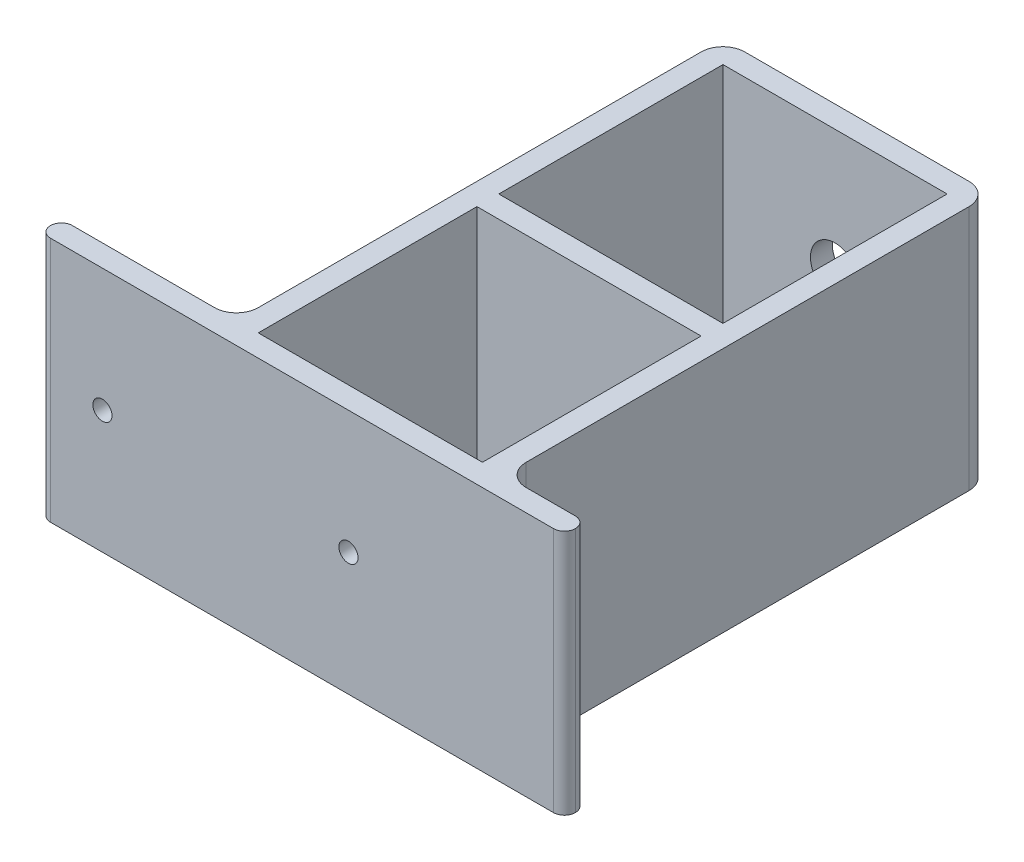
ISO-10303-21;
HEADER;
FILE_DESCRIPTION(('STEP AP214'),'2;1');
FILE_NAME('part.step','',(''),(''),'','','');
FILE_SCHEMA(('AUTOMOTIVE_DESIGN { 1 0 10303 214 1 1 1 1 }'));
ENDSEC;
DATA;
#1=APPLICATION_CONTEXT('core data for automotive mechanical design processes');
#2=APPLICATION_PROTOCOL_DEFINITION('international standard','automotive_design',2000,#1);
#3=PRODUCT_CONTEXT('',#1,'mechanical');
#4=PRODUCT('Part','Part','',(#3));
#5=PRODUCT_RELATED_PRODUCT_CATEGORY('part','',(#4));
#6=PRODUCT_DEFINITION_FORMATION('','',#4);
#7=PRODUCT_DEFINITION_CONTEXT('part definition',#1,'design');
#8=PRODUCT_DEFINITION('design','',#6,#7);
#9=PRODUCT_DEFINITION_SHAPE('','',#8);
#10=(LENGTH_UNIT() NAMED_UNIT(*) SI_UNIT(.MILLI.,.METRE.));
#11=(NAMED_UNIT(*) PLANE_ANGLE_UNIT() SI_UNIT($,.RADIAN.));
#12=(NAMED_UNIT(*) SI_UNIT($,.STERADIAN.) SOLID_ANGLE_UNIT());
#13=UNCERTAINTY_MEASURE_WITH_UNIT(LENGTH_MEASURE(1.E-05),#10,'distance_accuracy_value','');
#14=(GEOMETRIC_REPRESENTATION_CONTEXT(3) GLOBAL_UNCERTAINTY_ASSIGNED_CONTEXT((#13)) GLOBAL_UNIT_ASSIGNED_CONTEXT((#10,
#11,#12)) REPRESENTATION_CONTEXT('',''));
#15=CARTESIAN_POINT('',(0.,0.,0.));
#16=DIRECTION('',(0.,0.,1.));
#17=DIRECTION('',(1.,0.,0.));
#18=AXIS2_PLACEMENT_3D('',#15,#16,#17);
#19=CARTESIAN_POINT('',(-12.,-22.5,-85.));
#20=DIRECTION('',(-1.,0.,0.));
#21=DIRECTION('',(0.,-1.,0.));
#22=AXIS2_PLACEMENT_3D('',#19,#20,#21);
#23=PLANE('',#22);
#24=DIRECTION('',(0.,0.,1.));
#25=VECTOR('',#24,1.);
#26=CARTESIAN_POINT('',(-12.,-22.5,-85.));
#27=LINE('',#26,#25);
#28=CARTESIAN_POINT('',(-12.,-22.5,-40.));
#29=VERTEX_POINT('',#28);
#30=CARTESIAN_POINT('',(-12.,-22.5,0.));
#31=VERTEX_POINT('',#30);
#32=EDGE_CURVE('E242',#29,#31,#27,.T.);
#33=ORIENTED_EDGE('',*,*,#32,.F.);
#34=DIRECTION('',(0.,-1.,0.));
#35=VECTOR('',#34,1.);
#36=CARTESIAN_POINT('',(-12.,63.694659848092,-40.));
#37=LINE('',#36,#35);
#38=CARTESIAN_POINT('',(-12.,22.5,-40.));
#39=VERTEX_POINT('',#38);
#40=EDGE_CURVE('E413',#39,#29,#37,.T.);
#41=ORIENTED_EDGE('',*,*,#40,.F.);
#42=DIRECTION('',(0.,0.,1.));
#43=VECTOR('',#42,1.);
#44=CARTESIAN_POINT('',(-12.,22.5,-85.));
#45=LINE('',#44,#43);
#46=CARTESIAN_POINT('',(-12.,22.5,0.));
#47=VERTEX_POINT('',#46);
#48=EDGE_CURVE('E245',#39,#47,#45,.T.);
#49=ORIENTED_EDGE('',*,*,#48,.T.);
#50=DIRECTION('',(0.,-1.,0.));
#51=VECTOR('',#50,1.);
#52=CARTESIAN_POINT('',(-12.,-22.5,0.));
#53=LINE('',#52,#51);
#54=EDGE_CURVE('E219',#47,#31,#53,.T.);
#55=ORIENTED_EDGE('',*,*,#54,.T.);
#56=EDGE_LOOP('',(#33,#41,#49,#55));
#57=FACE_BOUND('',#56,.T.);
#58=ADVANCED_FACE('F39',(#57),#23,.F.);
#59=CARTESIAN_POINT('',(29.,-22.5,-85.));
#60=DIRECTION('',(1.,0.,0.));
#61=DIRECTION('',(0.,0.,-1.));
#62=AXIS2_PLACEMENT_3D('',#59,#60,#61);
#63=PLANE('',#62);
#64=DIRECTION('',(0.,0.,1.));
#65=VECTOR('',#64,1.);
#66=CARTESIAN_POINT('',(29.,22.5,-85.));
#67=LINE('',#66,#65);
#68=CARTESIAN_POINT('',(29.,22.5,-40.));
#69=VERTEX_POINT('',#68);
#70=CARTESIAN_POINT('',(29.,22.5,0.));
#71=VERTEX_POINT('',#70);
#72=EDGE_CURVE('E421',#69,#71,#67,.T.);
#73=ORIENTED_EDGE('',*,*,#72,.F.);
#74=DIRECTION('',(0.,-1.,0.));
#75=VECTOR('',#74,1.);
#76=CARTESIAN_POINT('',(29.,63.694659848092,-40.));
#77=LINE('',#76,#75);
#78=CARTESIAN_POINT('',(29.,-22.5,-40.));
#79=VERTEX_POINT('',#78);
#80=EDGE_CURVE('E199',#69,#79,#77,.T.);
#81=ORIENTED_EDGE('',*,*,#80,.T.);
#82=DIRECTION('',(0.,0.,1.));
#83=VECTOR('',#82,1.);
#84=CARTESIAN_POINT('',(29.,-22.5,-85.));
#85=LINE('',#84,#83);
#86=CARTESIAN_POINT('',(29.,-22.5,0.));
#87=VERTEX_POINT('',#86);
#88=EDGE_CURVE('E220',#79,#87,#85,.T.);
#89=ORIENTED_EDGE('',*,*,#88,.T.);
#90=DIRECTION('',(0.,1.,0.));
#91=VECTOR('',#90,1.);
#92=CARTESIAN_POINT('',(29.,-22.5,0.));
#93=LINE('',#92,#91);
#94=EDGE_CURVE('E408',#87,#71,#93,.T.);
#95=ORIENTED_EDGE('',*,*,#94,.T.);
#96=EDGE_LOOP('',(#73,#81,#89,#95));
#97=FACE_BOUND('',#96,.T.);
#98=ADVANCED_FACE('F528',(#97),#63,.F.);
#99=CARTESIAN_POINT('',(0.,0.,0.));
#100=DIRECTION('',(0.,0.,-1.));
#101=DIRECTION('',(-1.,0.,0.));
#102=AXIS2_PLACEMENT_3D('',#99,#100,#101);
#103=PLANE('',#102);
#104=CARTESIAN_POINT('',(8.49999999999997,0.,0.));
#105=DIRECTION('',(0.,0.,1.));
#106=DIRECTION('',(1.,0.,0.));
#107=AXIS2_PLACEMENT_3D('',#104,#105,#106);
#108=CIRCLE('',#107,1.75);
#109=CARTESIAN_POINT('',(10.25,0.,0.));
#110=VERTEX_POINT('',#109);
#111=EDGE_CURVE('E254',#110,#110,#108,.T.);
#112=ORIENTED_EDGE('',*,*,#111,.T.);
#113=EDGE_LOOP('',(#112));
#114=FACE_BOUND('',#113,.T.);
#115=DIRECTION('',(-1.,0.,0.));
#116=VECTOR('',#115,1.);
#117=CARTESIAN_POINT('',(-48.,22.5,0.));
#118=LINE('',#117,#116);
#119=EDGE_CURVE('E280',#71,#47,#118,.T.);
#120=ORIENTED_EDGE('',*,*,#119,.F.);
#121=ORIENTED_EDGE('',*,*,#94,.F.);
#122=DIRECTION('',(1.,0.,0.));
#123=VECTOR('',#122,1.);
#124=CARTESIAN_POINT('',(-48.,-22.5,0.));
#125=LINE('',#124,#123);
#126=EDGE_CURVE('E283',#31,#87,#125,.T.);
#127=ORIENTED_EDGE('',*,*,#126,.F.);
#128=ORIENTED_EDGE('',*,*,#54,.F.);
#129=EDGE_LOOP('',(#120,#121,#127,#128));
#130=FACE_BOUND('',#129,.T.);
#131=ADVANCED_FACE('F406',(#114,#130),#103,.T.);
#132=CARTESIAN_POINT('',(46.,22.5,0.));
#133=VERTEX_POINT('',#132);
#134=CARTESIAN_POINT('',(37.,22.5,0.));
#135=VERTEX_POINT('',#134);
#136=EDGE_CURVE('E276',#133,#135,#118,.T.);
#137=ORIENTED_EDGE('',*,*,#136,.F.);
#138=DIRECTION('',(0.,1.,0.));
#139=VECTOR('',#138,1.);
#140=CARTESIAN_POINT('',(46.,-22.5,0.));
#141=LINE('',#140,#139);
#142=CARTESIAN_POINT('',(46.,-22.5,0.));
#143=VERTEX_POINT('',#142);
#144=EDGE_CURVE('E11',#133,#143,#141,.F.);
#145=ORIENTED_EDGE('',*,*,#144,.T.);
#146=CARTESIAN_POINT('',(37.,-22.5,0.));
#147=VERTEX_POINT('',#146);
#148=EDGE_CURVE('E279',#147,#143,#125,.T.);
#149=ORIENTED_EDGE('',*,*,#148,.F.);
#150=DIRECTION('',(0.,-1.,0.));
#151=VECTOR('',#150,1.);
#152=CARTESIAN_POINT('',(37.,0.,0.));
#153=LINE('',#152,#151);
#154=EDGE_CURVE('E321',#147,#135,#153,.F.);
#155=ORIENTED_EDGE('',*,*,#154,.T.);
#156=EDGE_LOOP('',(#137,#145,#149,#155));
#157=FACE_BOUND('',#156,.T.);
#158=ADVANCED_FACE('F391',(#157),#103,.T.);
#159=CARTESIAN_POINT('',(-46.,-22.5,0.));
#160=VERTEX_POINT('',#159);
#161=CARTESIAN_POINT('',(-20.,-22.5,0.));
#162=VERTEX_POINT('',#161);
#163=EDGE_CURVE('E271',#160,#162,#125,.T.);
#164=ORIENTED_EDGE('',*,*,#163,.F.);
#165=DIRECTION('',(0.,-1.,0.));
#166=VECTOR('',#165,1.);
#167=CARTESIAN_POINT('',(-46.,22.5,0.));
#168=LINE('',#167,#166);
#169=CARTESIAN_POINT('',(-46.,22.5,0.));
#170=VERTEX_POINT('',#169);
#171=EDGE_CURVE('E49',#160,#170,#168,.F.);
#172=ORIENTED_EDGE('',*,*,#171,.T.);
#173=CARTESIAN_POINT('',(-20.,22.5,0.));
#174=VERTEX_POINT('',#173);
#175=EDGE_CURVE('E262',#174,#170,#118,.T.);
#176=ORIENTED_EDGE('',*,*,#175,.F.);
#177=DIRECTION('',(0.,1.,0.));
#178=VECTOR('',#177,1.);
#179=CARTESIAN_POINT('',(-20.,0.,0.));
#180=LINE('',#179,#178);
#181=EDGE_CURVE('E290',#174,#162,#180,.F.);
#182=ORIENTED_EDGE('',*,*,#181,.T.);
#183=EDGE_LOOP('',(#164,#172,#176,#182));
#184=FACE_BOUND('',#183,.T.);
#185=CARTESIAN_POINT('',(-36.5,0.,0.));
#186=DIRECTION('',(0.,0.,1.));
#187=DIRECTION('',(1.,0.,0.));
#188=AXIS2_PLACEMENT_3D('',#185,#186,#187);
#189=CIRCLE('',#188,1.75);
#190=CARTESIAN_POINT('',(-34.75,0.,0.));
#191=VERTEX_POINT('',#190);
#192=EDGE_CURVE('E249',#191,#191,#189,.T.);
#193=ORIENTED_EDGE('',*,*,#192,.T.);
#194=EDGE_LOOP('',(#193));
#195=FACE_BOUND('',#194,.T.);
#196=ADVANCED_FACE('F439',(#184,#195),#103,.T.);
#197=CARTESIAN_POINT('',(0.,0.,4.));
#198=DIRECTION('',(0.,0.,-1.));
#199=DIRECTION('',(-1.,0.,0.));
#200=AXIS2_PLACEMENT_3D('',#197,#198,#199);
#201=PLANE('',#200);
#202=DIRECTION('',(-1.,0.,0.));
#203=VECTOR('',#202,1.);
#204=CARTESIAN_POINT('',(-48.,22.5,4.));
#205=LINE('',#204,#203);
#206=CARTESIAN_POINT('',(46.,22.5,4.));
#207=VERTEX_POINT('',#206);
#208=CARTESIAN_POINT('',(-46.,22.5,4.));
#209=VERTEX_POINT('',#208);
#210=EDGE_CURVE('E266',#207,#209,#205,.T.);
#211=ORIENTED_EDGE('',*,*,#210,.T.);
#212=DIRECTION('',(0.,-1.,0.));
#213=VECTOR('',#212,1.);
#214=CARTESIAN_POINT('',(-46.,0.,4.));
#215=LINE('',#214,#213);
#216=CARTESIAN_POINT('',(-46.,-22.5,4.));
#217=VERTEX_POINT('',#216);
#218=EDGE_CURVE('E341',#209,#217,#215,.T.);
#219=ORIENTED_EDGE('',*,*,#218,.T.);
#220=DIRECTION('',(1.,0.,0.));
#221=VECTOR('',#220,1.);
#222=CARTESIAN_POINT('',(-48.,-22.5,4.));
#223=LINE('',#222,#221);
#224=CARTESIAN_POINT('',(46.,-22.5,4.));
#225=VERTEX_POINT('',#224);
#226=EDGE_CURVE('E270',#217,#225,#223,.T.);
#227=ORIENTED_EDGE('',*,*,#226,.T.);
#228=DIRECTION('',(0.,1.,0.));
#229=VECTOR('',#228,1.);
#230=CARTESIAN_POINT('',(46.,0.,4.));
#231=LINE('',#230,#229);
#232=EDGE_CURVE('E337',#225,#207,#231,.T.);
#233=ORIENTED_EDGE('',*,*,#232,.T.);
#234=EDGE_LOOP('',(#211,#219,#227,#233));
#235=FACE_BOUND('',#234,.T.);
#236=CARTESIAN_POINT('',(8.49999999999997,0.,4.));
#237=DIRECTION('',(0.,0.,1.));
#238=DIRECTION('',(1.,0.,0.));
#239=AXIS2_PLACEMENT_3D('',#236,#237,#238);
#240=CIRCLE('',#239,1.75);
#241=CARTESIAN_POINT('',(10.25,0.,4.));
#242=VERTEX_POINT('',#241);
#243=EDGE_CURVE('E258',#242,#242,#240,.T.);
#244=ORIENTED_EDGE('',*,*,#243,.F.);
#245=EDGE_LOOP('',(#244));
#246=FACE_BOUND('',#245,.T.);
#247=CARTESIAN_POINT('',(-36.5,0.,4.));
#248=DIRECTION('',(0.,0.,1.));
#249=DIRECTION('',(1.,0.,0.));
#250=AXIS2_PLACEMENT_3D('',#247,#248,#249);
#251=CIRCLE('',#250,1.75);
#252=CARTESIAN_POINT('',(-34.75,0.,4.));
#253=VERTEX_POINT('',#252);
#254=EDGE_CURVE('E250',#253,#253,#251,.T.);
#255=ORIENTED_EDGE('',*,*,#254,.F.);
#256=EDGE_LOOP('',(#255));
#257=FACE_BOUND('',#256,.T.);
#258=ADVANCED_FACE('F436',(#235,#246,#257),#201,.F.);
#259=CARTESIAN_POINT('',(-48.,22.5,4.));
#260=DIRECTION('',(0.,-1.,0.));
#261=DIRECTION('',(0.,0.,-1.));
#262=AXIS2_PLACEMENT_3D('',#259,#260,#261);
#263=PLANE('',#262);
#264=ORIENTED_EDGE('',*,*,#48,.F.);
#265=DIRECTION('',(1.,0.,0.));
#266=VECTOR('',#265,1.);
#267=CARTESIAN_POINT('',(-12.,22.5,-40.));
#268=LINE('',#267,#266);
#269=EDGE_CURVE('E505',#39,#69,#268,.T.);
#270=ORIENTED_EDGE('',*,*,#269,.T.);
#271=ORIENTED_EDGE('',*,*,#72,.T.);
#272=ORIENTED_EDGE('',*,*,#119,.T.);
#273=EDGE_LOOP('',(#264,#270,#271,#272));
#274=FACE_BOUND('',#273,.T.);
#275=CARTESIAN_POINT('',(-12.,22.5,-85.));
#276=VERTEX_POINT('',#275);
#277=CARTESIAN_POINT('',(-12.,22.5,-44.));
#278=VERTEX_POINT('',#277);
#279=EDGE_CURVE('E246',#276,#278,#45,.T.);
#280=ORIENTED_EDGE('',*,*,#279,.F.);
#281=DIRECTION('',(1.,0.,0.));
#282=VECTOR('',#281,1.);
#283=CARTESIAN_POINT('',(33.,22.5,-85.));
#284=LINE('',#283,#282);
#285=CARTESIAN_POINT('',(29.,22.5,-85.));
#286=VERTEX_POINT('',#285);
#287=EDGE_CURVE('E464',#276,#286,#284,.T.);
#288=ORIENTED_EDGE('',*,*,#287,.T.);
#289=CARTESIAN_POINT('',(29.,22.5,-44.));
#290=VERTEX_POINT('',#289);
#291=EDGE_CURVE('E227',#286,#290,#67,.T.);
#292=ORIENTED_EDGE('',*,*,#291,.T.);
#293=DIRECTION('',(-1.,0.,0.));
#294=VECTOR('',#293,1.);
#295=CARTESIAN_POINT('',(-12.,22.5,-44.));
#296=LINE('',#295,#294);
#297=EDGE_CURVE('E194',#290,#278,#296,.T.);
#298=ORIENTED_EDGE('',*,*,#297,.T.);
#299=EDGE_LOOP('',(#280,#288,#292,#298));
#300=FACE_BOUND('',#299,.T.);
#301=CARTESIAN_POINT('',(-46.,22.5,2.));
#302=DIRECTION('',(0.,-1.,0.));
#303=DIRECTION('',(0.,0.,-1.));
#304=AXIS2_PLACEMENT_3D('',#301,#302,#303);
#305=CIRCLE('',#304,2.);
#306=CARTESIAN_POINT('',(-48.,22.5,2.));
#307=VERTEX_POINT('',#306);
#308=EDGE_CURVE('E361',#170,#307,#305,.F.);
#309=ORIENTED_EDGE('',*,*,#308,.T.);
#310=CARTESIAN_POINT('',(-46.,22.5,2.));
#311=DIRECTION('',(0.,-1.,0.));
#312=DIRECTION('',(0.,0.,-1.));
#313=AXIS2_PLACEMENT_3D('',#310,#311,#312);
#314=CIRCLE('',#313,2.);
#315=EDGE_CURVE('E364',#307,#209,#314,.F.);
#316=ORIENTED_EDGE('',*,*,#315,.T.);
#317=ORIENTED_EDGE('',*,*,#210,.F.);
#318=CARTESIAN_POINT('',(46.,22.5,2.));
#319=DIRECTION('',(0.,-1.,0.));
#320=DIRECTION('',(0.,0.,-1.));
#321=AXIS2_PLACEMENT_3D('',#318,#319,#320);
#322=CIRCLE('',#321,2.);
#323=CARTESIAN_POINT('',(48.,22.5,2.));
#324=VERTEX_POINT('',#323);
#325=EDGE_CURVE('E62',#207,#324,#322,.F.);
#326=ORIENTED_EDGE('',*,*,#325,.T.);
#327=CARTESIAN_POINT('',(46.,22.5,2.));
#328=DIRECTION('',(0.,-1.,0.));
#329=DIRECTION('',(0.,0.,-1.));
#330=AXIS2_PLACEMENT_3D('',#327,#328,#329);
#331=CIRCLE('',#330,2.);
#332=EDGE_CURVE('E57',#324,#133,#331,.F.);
#333=ORIENTED_EDGE('',*,*,#332,.T.);
#334=ORIENTED_EDGE('',*,*,#136,.T.);
#335=CARTESIAN_POINT('',(37.,22.5,-4.));
#336=DIRECTION('',(0.,-1.,0.));
#337=DIRECTION('',(0.,0.,-1.));
#338=AXIS2_PLACEMENT_3D('',#335,#336,#337);
#339=CIRCLE('',#338,4.);
#340=CARTESIAN_POINT('',(33.,22.5,-4.));
#341=VERTEX_POINT('',#340);
#342=EDGE_CURVE('E334',#135,#341,#339,.T.);
#343=ORIENTED_EDGE('',*,*,#342,.T.);
#344=DIRECTION('',(0.,0.,1.));
#345=VECTOR('',#344,1.);
#346=CARTESIAN_POINT('',(33.,22.5,-85.));
#347=LINE('',#346,#345);
#348=CARTESIAN_POINT('',(33.,22.5,-85.));
#349=VERTEX_POINT('',#348);
#350=EDGE_CURVE('E483',#349,#341,#347,.T.);
#351=ORIENTED_EDGE('',*,*,#350,.F.);
#352=CARTESIAN_POINT('',(29.,22.5,-85.));
#353=DIRECTION('',(0.,-1.,0.));
#354=DIRECTION('',(0.,0.,-1.));
#355=AXIS2_PLACEMENT_3D('',#352,#353,#354);
#356=CIRCLE('',#355,4.);
#357=CARTESIAN_POINT('',(29.,22.5,-89.));
#358=VERTEX_POINT('',#357);
#359=EDGE_CURVE('E302',#349,#358,#356,.F.);
#360=ORIENTED_EDGE('',*,*,#359,.T.);
#361=DIRECTION('',(1.,0.,0.));
#362=VECTOR('',#361,1.);
#363=CARTESIAN_POINT('',(33.,22.5,-89.));
#364=LINE('',#363,#362);
#365=CARTESIAN_POINT('',(-12.,22.5,-89.));
#366=VERTEX_POINT('',#365);
#367=EDGE_CURVE('E463',#366,#358,#364,.T.);
#368=ORIENTED_EDGE('',*,*,#367,.F.);
#369=CARTESIAN_POINT('',(-12.,22.5,-85.));
#370=DIRECTION('',(0.,-1.,0.));
#371=DIRECTION('',(0.,0.,-1.));
#372=AXIS2_PLACEMENT_3D('',#369,#370,#371);
#373=CIRCLE('',#372,4.);
#374=CARTESIAN_POINT('',(-16.,22.5,-85.));
#375=VERTEX_POINT('',#374);
#376=EDGE_CURVE('E305',#366,#375,#373,.F.);
#377=ORIENTED_EDGE('',*,*,#376,.T.);
#378=DIRECTION('',(0.,0.,1.));
#379=VECTOR('',#378,1.);
#380=CARTESIAN_POINT('',(-16.,22.5,-85.));
#381=LINE('',#380,#379);
#382=CARTESIAN_POINT('',(-16.,22.5,-4.));
#383=VERTEX_POINT('',#382);
#384=EDGE_CURVE('E233',#375,#383,#381,.T.);
#385=ORIENTED_EDGE('',*,*,#384,.T.);
#386=CARTESIAN_POINT('',(-20.,22.5,-4.));
#387=DIRECTION('',(0.,-1.,0.));
#388=DIRECTION('',(0.,0.,-1.));
#389=AXIS2_PLACEMENT_3D('',#386,#387,#388);
#390=CIRCLE('',#389,4.);
#391=EDGE_CURVE('E325',#383,#174,#390,.T.);
#392=ORIENTED_EDGE('',*,*,#391,.T.);
#393=ORIENTED_EDGE('',*,*,#175,.T.);
#394=EDGE_LOOP('',(#309,#316,#317,#326,#333,#334,#343,#351,#360,#368,#377,#385,#392,#393));
#395=FACE_BOUND('',#394,.T.);
#396=ADVANCED_FACE('F418',(#274,#300,#395),#263,.F.);
#397=CARTESIAN_POINT('',(-48.,-22.5,4.));
#398=DIRECTION('',(0.,1.,0.));
#399=DIRECTION('',(0.,0.,1.));
#400=AXIS2_PLACEMENT_3D('',#397,#398,#399);
#401=PLANE('',#400);
#402=CARTESIAN_POINT('',(-12.,-22.5,-85.));
#403=VERTEX_POINT('',#402);
#404=CARTESIAN_POINT('',(-12.,-22.5,-44.));
#405=VERTEX_POINT('',#404);
#406=EDGE_CURVE('E210',#403,#405,#27,.T.);
#407=ORIENTED_EDGE('',*,*,#406,.T.);
#408=DIRECTION('',(1.,0.,0.));
#409=VECTOR('',#408,1.);
#410=CARTESIAN_POINT('',(-12.,-22.5,-44.));
#411=LINE('',#410,#409);
#412=CARTESIAN_POINT('',(29.,-22.5,-44.));
#413=VERTEX_POINT('',#412);
#414=EDGE_CURVE('E192',#405,#413,#411,.T.);
#415=ORIENTED_EDGE('',*,*,#414,.T.);
#416=CARTESIAN_POINT('',(29.,-22.5,-85.));
#417=VERTEX_POINT('',#416);
#418=EDGE_CURVE('E208',#417,#413,#85,.T.);
#419=ORIENTED_EDGE('',*,*,#418,.F.);
#420=DIRECTION('',(-1.,0.,0.));
#421=VECTOR('',#420,1.);
#422=CARTESIAN_POINT('',(33.,-22.5,-85.));
#423=LINE('',#422,#421);
#424=EDGE_CURVE('E470',#417,#403,#423,.T.);
#425=ORIENTED_EDGE('',*,*,#424,.T.);
#426=EDGE_LOOP('',(#407,#415,#419,#425));
#427=FACE_BOUND('',#426,.T.);
#428=ORIENTED_EDGE('',*,*,#226,.F.);
#429=CARTESIAN_POINT('',(-46.,-22.5,2.));
#430=DIRECTION('',(0.,1.,0.));
#431=DIRECTION('',(0.,0.,1.));
#432=AXIS2_PLACEMENT_3D('',#429,#430,#431);
#433=CIRCLE('',#432,2.);
#434=CARTESIAN_POINT('',(-48.,-22.5,2.));
#435=VERTEX_POINT('',#434);
#436=EDGE_CURVE('E354',#217,#435,#433,.F.);
#437=ORIENTED_EDGE('',*,*,#436,.T.);
#438=CARTESIAN_POINT('',(-46.,-22.5,2.));
#439=DIRECTION('',(0.,1.,0.));
#440=DIRECTION('',(0.,0.,1.));
#441=AXIS2_PLACEMENT_3D('',#438,#439,#440);
#442=CIRCLE('',#441,2.);
#443=EDGE_CURVE('E351',#435,#160,#442,.F.);
#444=ORIENTED_EDGE('',*,*,#443,.T.);
#445=ORIENTED_EDGE('',*,*,#163,.T.);
#446=CARTESIAN_POINT('',(-20.,-22.5,-4.));
#447=DIRECTION('',(0.,1.,0.));
#448=DIRECTION('',(0.,0.,1.));
#449=AXIS2_PLACEMENT_3D('',#446,#447,#448);
#450=CIRCLE('',#449,4.);
#451=CARTESIAN_POINT('',(-16.,-22.5,-4.));
#452=VERTEX_POINT('',#451);
#453=EDGE_CURVE('E328',#162,#452,#450,.T.);
#454=ORIENTED_EDGE('',*,*,#453,.T.);
#455=DIRECTION('',(0.,0.,1.));
#456=VECTOR('',#455,1.);
#457=CARTESIAN_POINT('',(-16.,-22.5,-85.));
#458=LINE('',#457,#456);
#459=CARTESIAN_POINT('',(-16.,-22.5,-85.));
#460=VERTEX_POINT('',#459);
#461=EDGE_CURVE('E238',#460,#452,#458,.T.);
#462=ORIENTED_EDGE('',*,*,#461,.F.);
#463=CARTESIAN_POINT('',(-12.,-22.5,-85.));
#464=DIRECTION('',(0.,1.,0.));
#465=DIRECTION('',(0.,0.,1.));
#466=AXIS2_PLACEMENT_3D('',#463,#464,#465);
#467=CIRCLE('',#466,4.);
#468=CARTESIAN_POINT('',(-12.,-22.5,-89.));
#469=VERTEX_POINT('',#468);
#470=EDGE_CURVE('E311',#460,#469,#467,.F.);
#471=ORIENTED_EDGE('',*,*,#470,.T.);
#472=DIRECTION('',(-1.,0.,0.));
#473=VECTOR('',#472,1.);
#474=CARTESIAN_POINT('',(33.,-22.5,-89.));
#475=LINE('',#474,#473);
#476=CARTESIAN_POINT('',(29.,-22.5,-89.));
#477=VERTEX_POINT('',#476);
#478=EDGE_CURVE('E456',#477,#469,#475,.T.);
#479=ORIENTED_EDGE('',*,*,#478,.F.);
#480=CARTESIAN_POINT('',(29.,-22.5,-85.));
#481=DIRECTION('',(0.,1.,0.));
#482=DIRECTION('',(0.,0.,1.));
#483=AXIS2_PLACEMENT_3D('',#480,#481,#482);
#484=CIRCLE('',#483,4.);
#485=CARTESIAN_POINT('',(33.,-22.5,-85.));
#486=VERTEX_POINT('',#485);
#487=EDGE_CURVE('E308',#477,#486,#484,.F.);
#488=ORIENTED_EDGE('',*,*,#487,.T.);
#489=DIRECTION('',(0.,0.,1.));
#490=VECTOR('',#489,1.);
#491=CARTESIAN_POINT('',(33.,-22.5,-85.));
#492=LINE('',#491,#490);
#493=CARTESIAN_POINT('',(33.,-22.5,-4.));
#494=VERTEX_POINT('',#493);
#495=EDGE_CURVE('E479',#486,#494,#492,.T.);
#496=ORIENTED_EDGE('',*,*,#495,.T.);
#497=CARTESIAN_POINT('',(37.,-22.5,-4.));
#498=DIRECTION('',(0.,1.,0.));
#499=DIRECTION('',(0.,0.,1.));
#500=AXIS2_PLACEMENT_3D('',#497,#498,#499);
#501=CIRCLE('',#500,4.);
#502=EDGE_CURVE('E331',#494,#147,#501,.T.);
#503=ORIENTED_EDGE('',*,*,#502,.T.);
#504=ORIENTED_EDGE('',*,*,#148,.T.);
#505=CARTESIAN_POINT('',(46.,-22.5,2.));
#506=DIRECTION('',(0.,1.,0.));
#507=DIRECTION('',(0.,0.,1.));
#508=AXIS2_PLACEMENT_3D('',#505,#506,#507);
#509=CIRCLE('',#508,2.);
#510=CARTESIAN_POINT('',(48.,-22.5,2.));
#511=VERTEX_POINT('',#510);
#512=EDGE_CURVE('E345',#143,#511,#509,.F.);
#513=ORIENTED_EDGE('',*,*,#512,.T.);
#514=CARTESIAN_POINT('',(46.,-22.5,2.));
#515=DIRECTION('',(0.,1.,0.));
#516=DIRECTION('',(0.,0.,1.));
#517=AXIS2_PLACEMENT_3D('',#514,#515,#516);
#518=CIRCLE('',#517,2.);
#519=EDGE_CURVE('E348',#511,#225,#518,.F.);
#520=ORIENTED_EDGE('',*,*,#519,.T.);
#521=EDGE_LOOP('',(#428,#437,#444,#445,#454,#462,#471,#479,#488,#496,#503,#504,#513,#520));
#522=FACE_BOUND('',#521,.T.);
#523=DIRECTION('',(-1.,0.,0.));
#524=VECTOR('',#523,1.);
#525=CARTESIAN_POINT('',(-12.,-22.5,-40.));
#526=LINE('',#525,#524);
#527=EDGE_CURVE('E212',#79,#29,#526,.T.);
#528=ORIENTED_EDGE('',*,*,#527,.T.);
#529=ORIENTED_EDGE('',*,*,#32,.T.);
#530=ORIENTED_EDGE('',*,*,#126,.T.);
#531=ORIENTED_EDGE('',*,*,#88,.F.);
#532=EDGE_LOOP('',(#528,#529,#530,#531));
#533=FACE_BOUND('',#532,.T.);
#534=ADVANCED_FACE('F205',(#427,#522,#533),#401,.F.);
#535=CARTESIAN_POINT('',(8.49999999999997,0.,4.));
#536=DIRECTION('',(0.,0.,-1.));
#537=DIRECTION('',(-1.,0.,0.));
#538=AXIS2_PLACEMENT_3D('',#535,#536,#537);
#539=CYLINDRICAL_SURFACE('',#538,1.75);
#540=ORIENTED_EDGE('',*,*,#243,.T.);
#541=EDGE_LOOP('',(#540));
#542=FACE_BOUND('',#541,.T.);
#543=ORIENTED_EDGE('',*,*,#111,.F.);
#544=EDGE_LOOP('',(#543));
#545=FACE_BOUND('',#544,.T.);
#546=ADVANCED_FACE('F543',(#542,#545),#539,.F.);
#547=CARTESIAN_POINT('',(-36.5,0.,4.));
#548=DIRECTION('',(0.,0.,-1.));
#549=DIRECTION('',(-1.,0.,0.));
#550=AXIS2_PLACEMENT_3D('',#547,#548,#549);
#551=CYLINDRICAL_SURFACE('',#550,1.75);
#552=ORIENTED_EDGE('',*,*,#254,.T.);
#553=EDGE_LOOP('',(#552));
#554=FACE_BOUND('',#553,.T.);
#555=ORIENTED_EDGE('',*,*,#192,.F.);
#556=EDGE_LOOP('',(#555));
#557=FACE_BOUND('',#556,.T.);
#558=ADVANCED_FACE('F538',(#554,#557),#551,.F.);
#559=ORIENTED_EDGE('',*,*,#279,.T.);
#560=DIRECTION('',(0.,-1.,0.));
#561=VECTOR('',#560,1.);
#562=CARTESIAN_POINT('',(-12.,63.694659848092,-44.));
#563=LINE('',#562,#561);
#564=EDGE_CURVE('E200',#278,#405,#563,.T.);
#565=ORIENTED_EDGE('',*,*,#564,.T.);
#566=ORIENTED_EDGE('',*,*,#406,.F.);
#567=DIRECTION('',(0.,-1.,0.));
#568=VECTOR('',#567,1.);
#569=CARTESIAN_POINT('',(-12.,-22.5,-85.));
#570=LINE('',#569,#568);
#571=EDGE_CURVE('E225',#276,#403,#570,.T.);
#572=ORIENTED_EDGE('',*,*,#571,.F.);
#573=EDGE_LOOP('',(#559,#565,#566,#572));
#574=FACE_BOUND('',#573,.T.);
#575=ADVANCED_FACE('F496',(#574),#23,.F.);
#576=CARTESIAN_POINT('',(-16.,22.5,-85.));
#577=DIRECTION('',(1.,0.,0.));
#578=DIRECTION('',(0.,0.,-1.));
#579=AXIS2_PLACEMENT_3D('',#576,#577,#578);
#580=PLANE('',#579);
#581=ORIENTED_EDGE('',*,*,#461,.T.);
#582=DIRECTION('',(0.,1.,0.));
#583=VECTOR('',#582,1.);
#584=CARTESIAN_POINT('',(-16.,22.5,-4.));
#585=LINE('',#584,#583);
#586=EDGE_CURVE('E286',#452,#383,#585,.T.);
#587=ORIENTED_EDGE('',*,*,#586,.T.);
#588=ORIENTED_EDGE('',*,*,#384,.F.);
#589=DIRECTION('',(0.,1.,0.));
#590=VECTOR('',#589,1.);
#591=CARTESIAN_POINT('',(-16.,-22.5,-85.));
#592=LINE('',#591,#590);
#593=EDGE_CURVE('E275',#375,#460,#592,.F.);
#594=ORIENTED_EDGE('',*,*,#593,.T.);
#595=EDGE_LOOP('',(#581,#587,#588,#594));
#596=FACE_BOUND('',#595,.T.);
#597=ADVANCED_FACE('F448',(#596),#580,.F.);
#598=ORIENTED_EDGE('',*,*,#418,.T.);
#599=DIRECTION('',(0.,-1.,0.));
#600=VECTOR('',#599,1.);
#601=CARTESIAN_POINT('',(29.,63.694659848092,-44.));
#602=LINE('',#601,#600);
#603=EDGE_CURVE('E188',#290,#413,#602,.T.);
#604=ORIENTED_EDGE('',*,*,#603,.F.);
#605=ORIENTED_EDGE('',*,*,#291,.F.);
#606=DIRECTION('',(0.,1.,0.));
#607=VECTOR('',#606,1.);
#608=CARTESIAN_POINT('',(29.,-22.5,-85.));
#609=LINE('',#608,#607);
#610=EDGE_CURVE('E217',#417,#286,#609,.T.);
#611=ORIENTED_EDGE('',*,*,#610,.F.);
#612=EDGE_LOOP('',(#598,#604,#605,#611));
#613=FACE_BOUND('',#612,.T.);
#614=ADVANCED_FACE('F215',(#613),#63,.F.);
#615=CARTESIAN_POINT('',(33.,22.5,-85.));
#616=DIRECTION('',(-1.,0.,0.));
#617=DIRECTION('',(0.,0.,1.));
#618=AXIS2_PLACEMENT_3D('',#615,#616,#617);
#619=PLANE('',#618);
#620=ORIENTED_EDGE('',*,*,#495,.F.);
#621=DIRECTION('',(0.,-1.,0.));
#622=VECTOR('',#621,1.);
#623=CARTESIAN_POINT('',(33.,22.5,-85.));
#624=LINE('',#623,#622);
#625=EDGE_CURVE('E318',#486,#349,#624,.F.);
#626=ORIENTED_EDGE('',*,*,#625,.T.);
#627=ORIENTED_EDGE('',*,*,#350,.T.);
#628=DIRECTION('',(0.,-1.,0.));
#629=VECTOR('',#628,1.);
#630=CARTESIAN_POINT('',(33.,22.5,-4.));
#631=LINE('',#630,#629);
#632=EDGE_CURVE('E314',#341,#494,#631,.T.);
#633=ORIENTED_EDGE('',*,*,#632,.T.);
#634=EDGE_LOOP('',(#620,#626,#627,#633));
#635=FACE_BOUND('',#634,.T.);
#636=ADVANCED_FACE('F517',(#635),#619,.F.);
#637=CARTESIAN_POINT('',(0.,0.,-85.));
#638=DIRECTION('',(0.,0.,-1.));
#639=DIRECTION('',(-1.,0.,0.));
#640=AXIS2_PLACEMENT_3D('',#637,#638,#639);
#641=PLANE('',#640);
#642=CARTESIAN_POINT('',(8.49999999999998,0.,-85.));
#643=DIRECTION('',(0.,0.,-1.));
#644=DIRECTION('',(-1.,0.,0.));
#645=AXIS2_PLACEMENT_3D('',#642,#643,#644);
#646=CIRCLE('',#645,4.5);
#647=CARTESIAN_POINT('',(3.99999999999998,0.,-85.));
#648=VERTEX_POINT('',#647);
#649=EDGE_CURVE('E213',#648,#648,#646,.F.);
#650=ORIENTED_EDGE('',*,*,#649,.F.);
#651=EDGE_LOOP('',(#650));
#652=FACE_BOUND('',#651,.T.);
#653=ORIENTED_EDGE('',*,*,#287,.F.);
#654=ORIENTED_EDGE('',*,*,#571,.T.);
#655=ORIENTED_EDGE('',*,*,#424,.F.);
#656=ORIENTED_EDGE('',*,*,#610,.T.);
#657=EDGE_LOOP('',(#653,#654,#655,#656));
#658=FACE_BOUND('',#657,.T.);
#659=ADVANCED_FACE('F493',(#652,#658),#641,.F.);
#660=CARTESIAN_POINT('',(0.,0.,-89.));
#661=DIRECTION('',(0.,0.,-1.));
#662=DIRECTION('',(-1.,0.,0.));
#663=AXIS2_PLACEMENT_3D('',#660,#661,#662);
#664=PLANE('',#663);
#665=CARTESIAN_POINT('',(8.49999999999998,0.,-89.));
#666=DIRECTION('',(0.,0.,-1.));
#667=DIRECTION('',(-1.,0.,0.));
#668=AXIS2_PLACEMENT_3D('',#665,#666,#667);
#669=CIRCLE('',#668,4.5);
#670=CARTESIAN_POINT('',(3.99999999999998,0.,-89.));
#671=VERTEX_POINT('',#670);
#672=EDGE_CURVE('E371',#671,#671,#669,.T.);
#673=ORIENTED_EDGE('',*,*,#672,.F.);
#674=EDGE_LOOP('',(#673));
#675=FACE_BOUND('',#674,.T.);
#676=ORIENTED_EDGE('',*,*,#478,.T.);
#677=DIRECTION('',(0.,1.,0.));
#678=VECTOR('',#677,1.);
#679=CARTESIAN_POINT('',(-12.,22.5,-89.));
#680=LINE('',#679,#678);
#681=EDGE_CURVE('E298',#469,#366,#680,.T.);
#682=ORIENTED_EDGE('',*,*,#681,.T.);
#683=ORIENTED_EDGE('',*,*,#367,.T.);
#684=DIRECTION('',(0.,-1.,0.));
#685=VECTOR('',#684,1.);
#686=CARTESIAN_POINT('',(29.,-22.5,-89.));
#687=LINE('',#686,#685);
#688=EDGE_CURVE('E294',#358,#477,#687,.T.);
#689=ORIENTED_EDGE('',*,*,#688,.T.);
#690=EDGE_LOOP('',(#676,#682,#683,#689));
#691=FACE_BOUND('',#690,.T.);
#692=ADVANCED_FACE('F458',(#675,#691),#664,.T.);
#693=CARTESIAN_POINT('',(-12.,63.694659848092,-40.));
#694=DIRECTION('',(0.,0.,1.));
#695=DIRECTION('',(1.,0.,0.));
#696=AXIS2_PLACEMENT_3D('',#693,#694,#695);
#697=PLANE('',#696);
#698=ORIENTED_EDGE('',*,*,#269,.F.);
#699=ORIENTED_EDGE('',*,*,#40,.T.);
#700=ORIENTED_EDGE('',*,*,#527,.F.);
#701=ORIENTED_EDGE('',*,*,#80,.F.);
#702=EDGE_LOOP('',(#698,#699,#700,#701));
#703=FACE_BOUND('',#702,.T.);
#704=ADVANCED_FACE('F523',(#703),#697,.T.);
#705=CARTESIAN_POINT('',(-12.,63.694659848092,-44.));
#706=DIRECTION('',(0.,0.,-1.));
#707=DIRECTION('',(-1.,0.,0.));
#708=AXIS2_PLACEMENT_3D('',#705,#706,#707);
#709=PLANE('',#708);
#710=ORIENTED_EDGE('',*,*,#297,.F.);
#711=ORIENTED_EDGE('',*,*,#603,.T.);
#712=ORIENTED_EDGE('',*,*,#414,.F.);
#713=ORIENTED_EDGE('',*,*,#564,.F.);
#714=EDGE_LOOP('',(#710,#711,#712,#713));
#715=FACE_BOUND('',#714,.T.);
#716=ADVANCED_FACE('F190',(#715),#709,.T.);
#717=CARTESIAN_POINT('',(-20.,22.5,-4.));
#718=DIRECTION('',(0.,1.,0.));
#719=DIRECTION('',(0.,0.,1.));
#720=AXIS2_PLACEMENT_3D('',#717,#718,#719);
#721=CYLINDRICAL_SURFACE('',#720,4.);
#722=ORIENTED_EDGE('',*,*,#453,.F.);
#723=ORIENTED_EDGE('',*,*,#181,.F.);
#724=ORIENTED_EDGE('',*,*,#391,.F.);
#725=ORIENTED_EDGE('',*,*,#586,.F.);
#726=EDGE_LOOP('',(#722,#723,#724,#725));
#727=FACE_BOUND('',#726,.T.);
#728=ADVANCED_FACE('F444',(#727),#721,.F.);
#729=CARTESIAN_POINT('',(-12.,0.,-85.));
#730=DIRECTION('',(0.,-1.,0.));
#731=DIRECTION('',(0.,0.,-1.));
#732=AXIS2_PLACEMENT_3D('',#729,#730,#731);
#733=CYLINDRICAL_SURFACE('',#732,4.);
#734=ORIENTED_EDGE('',*,*,#470,.F.);
#735=ORIENTED_EDGE('',*,*,#593,.F.);
#736=ORIENTED_EDGE('',*,*,#376,.F.);
#737=ORIENTED_EDGE('',*,*,#681,.F.);
#738=EDGE_LOOP('',(#734,#735,#736,#737));
#739=FACE_BOUND('',#738,.T.);
#740=ADVANCED_FACE('F452',(#739),#733,.T.);
#741=CARTESIAN_POINT('',(29.,0.,-85.));
#742=DIRECTION('',(0.,1.,0.));
#743=DIRECTION('',(0.,0.,1.));
#744=AXIS2_PLACEMENT_3D('',#741,#742,#743);
#745=CYLINDRICAL_SURFACE('',#744,4.);
#746=ORIENTED_EDGE('',*,*,#359,.F.);
#747=ORIENTED_EDGE('',*,*,#625,.F.);
#748=ORIENTED_EDGE('',*,*,#487,.F.);
#749=ORIENTED_EDGE('',*,*,#688,.F.);
#750=EDGE_LOOP('',(#746,#747,#748,#749));
#751=FACE_BOUND('',#750,.T.);
#752=ADVANCED_FACE('F565',(#751),#745,.T.);
#753=CARTESIAN_POINT('',(37.,22.5,-4.));
#754=DIRECTION('',(0.,-1.,0.));
#755=DIRECTION('',(0.,0.,-1.));
#756=AXIS2_PLACEMENT_3D('',#753,#754,#755);
#757=CYLINDRICAL_SURFACE('',#756,4.);
#758=ORIENTED_EDGE('',*,*,#342,.F.);
#759=ORIENTED_EDGE('',*,*,#154,.F.);
#760=ORIENTED_EDGE('',*,*,#502,.F.);
#761=ORIENTED_EDGE('',*,*,#632,.F.);
#762=EDGE_LOOP('',(#758,#759,#760,#761));
#763=FACE_BOUND('',#762,.T.);
#764=ADVANCED_FACE('F568',(#763),#757,.F.);
#765=CARTESIAN_POINT('',(8.49999999999998,0.,-72.2720779386422));
#766=DIRECTION('',(0.,0.,-1.));
#767=DIRECTION('',(-1.,0.,0.));
#768=AXIS2_PLACEMENT_3D('',#765,#766,#767);
#769=CYLINDRICAL_SURFACE('',#768,4.5);
#770=ORIENTED_EDGE('',*,*,#649,.T.);
#771=EDGE_LOOP('',(#770));
#772=FACE_BOUND('',#771,.T.);
#773=ORIENTED_EDGE('',*,*,#672,.T.);
#774=EDGE_LOOP('',(#773));
#775=FACE_BOUND('',#774,.T.);
#776=ADVANCED_FACE('F513',(#772,#775),#769,.F.);
#777=CARTESIAN_POINT('',(-46.,-22.5,2.));
#778=DIRECTION('',(0.,1.,0.));
#779=DIRECTION('',(0.,0.,1.));
#780=AXIS2_PLACEMENT_3D('',#777,#778,#779);
#781=CYLINDRICAL_SURFACE('',#780,2.);
#782=DIRECTION('',(0.,-1.,0.));
#783=VECTOR('',#782,1.);
#784=CARTESIAN_POINT('',(-48.,-22.5,2.));
#785=LINE('',#784,#783);
#786=EDGE_CURVE('E368',#307,#435,#785,.T.);
#787=ORIENTED_EDGE('',*,*,#786,.F.);
#788=ORIENTED_EDGE('',*,*,#308,.F.);
#789=ORIENTED_EDGE('',*,*,#171,.F.);
#790=ORIENTED_EDGE('',*,*,#443,.F.);
#791=EDGE_LOOP('',(#787,#788,#789,#790));
#792=FACE_BOUND('',#791,.T.);
#793=ADVANCED_FACE('F431',(#792),#781,.T.);
#794=CARTESIAN_POINT('',(-46.,0.,2.));
#795=DIRECTION('',(0.,-1.,0.));
#796=DIRECTION('',(0.,0.,-1.));
#797=AXIS2_PLACEMENT_3D('',#794,#795,#796);
#798=CYLINDRICAL_SURFACE('',#797,2.);
#799=ORIENTED_EDGE('',*,*,#315,.F.);
#800=ORIENTED_EDGE('',*,*,#786,.T.);
#801=ORIENTED_EDGE('',*,*,#436,.F.);
#802=ORIENTED_EDGE('',*,*,#218,.F.);
#803=EDGE_LOOP('',(#799,#800,#801,#802));
#804=FACE_BOUND('',#803,.T.);
#805=ADVANCED_FACE('F434',(#804),#798,.T.);
#806=CARTESIAN_POINT('',(46.,-22.5,2.));
#807=DIRECTION('',(0.,-1.,0.));
#808=DIRECTION('',(0.,0.,-1.));
#809=AXIS2_PLACEMENT_3D('',#806,#807,#808);
#810=CYLINDRICAL_SURFACE('',#809,2.);
#811=DIRECTION('',(0.,1.,0.));
#812=VECTOR('',#811,1.);
#813=CARTESIAN_POINT('',(48.,22.5,2.));
#814=LINE('',#813,#812);
#815=EDGE_CURVE('E43',#511,#324,#814,.T.);
#816=ORIENTED_EDGE('',*,*,#815,.F.);
#817=ORIENTED_EDGE('',*,*,#512,.F.);
#818=ORIENTED_EDGE('',*,*,#144,.F.);
#819=ORIENTED_EDGE('',*,*,#332,.F.);
#820=EDGE_LOOP('',(#816,#817,#818,#819));
#821=FACE_BOUND('',#820,.T.);
#822=ADVANCED_FACE('F41',(#821),#810,.T.);
#823=CARTESIAN_POINT('',(46.,0.,2.));
#824=DIRECTION('',(0.,1.,0.));
#825=DIRECTION('',(0.,0.,1.));
#826=AXIS2_PLACEMENT_3D('',#823,#824,#825);
#827=CYLINDRICAL_SURFACE('',#826,2.);
#828=ORIENTED_EDGE('',*,*,#519,.F.);
#829=ORIENTED_EDGE('',*,*,#815,.T.);
#830=ORIENTED_EDGE('',*,*,#325,.F.);
#831=ORIENTED_EDGE('',*,*,#232,.F.);
#832=EDGE_LOOP('',(#828,#829,#830,#831));
#833=FACE_BOUND('',#832,.T.);
#834=ADVANCED_FACE('F383',(#833),#827,.T.);
#835=CLOSED_SHELL('',(#58,#98,#131,#158,#196,#258,#396,#534,#546,#558,#575,#597,#614,#636,#659,
#692,#704,#716,#728,#740,#752,#764,#776,#793,#805,#822,#834));
#836=MANIFOLD_SOLID_BREP('B2',#835);
#837=ADVANCED_BREP_SHAPE_REPRESENTATION('',(#18,#836),#14);
#838=SHAPE_DEFINITION_REPRESENTATION(#9,#837);
ENDSEC;
END-ISO-10303-21;
